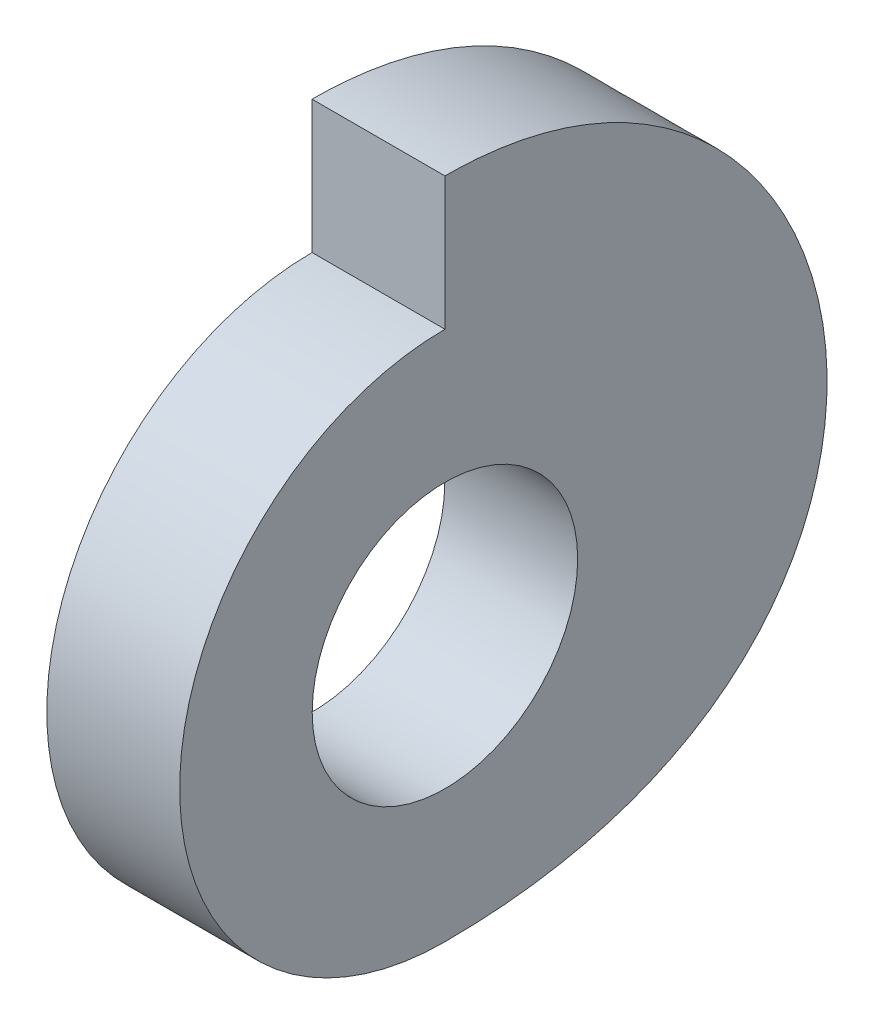
ISO-10303-21;
HEADER;
FILE_DESCRIPTION(('STEP AP214'),'2;1');
FILE_NAME('part.step','',(''),(''),'','','');
FILE_SCHEMA(('AUTOMOTIVE_DESIGN { 1 0 10303 214 1 1 1 1 }'));
ENDSEC;
DATA;
#1=APPLICATION_CONTEXT('core data for automotive mechanical design processes');
#2=APPLICATION_PROTOCOL_DEFINITION('international standard','automotive_design',2000,#1);
#3=PRODUCT_CONTEXT('',#1,'mechanical');
#4=PRODUCT('Part','Part','',(#3));
#5=PRODUCT_RELATED_PRODUCT_CATEGORY('part','',(#4));
#6=PRODUCT_DEFINITION_FORMATION('','',#4);
#7=PRODUCT_DEFINITION_CONTEXT('part definition',#1,'design');
#8=PRODUCT_DEFINITION('design','',#6,#7);
#9=PRODUCT_DEFINITION_SHAPE('','',#8);
#10=(LENGTH_UNIT() NAMED_UNIT(*) SI_UNIT(.MILLI.,.METRE.));
#11=(NAMED_UNIT(*) PLANE_ANGLE_UNIT() SI_UNIT($,.RADIAN.));
#12=(NAMED_UNIT(*) SI_UNIT($,.STERADIAN.) SOLID_ANGLE_UNIT());
#13=UNCERTAINTY_MEASURE_WITH_UNIT(LENGTH_MEASURE(1.E-05),#10,'distance_accuracy_value','');
#14=(GEOMETRIC_REPRESENTATION_CONTEXT(3) GLOBAL_UNCERTAINTY_ASSIGNED_CONTEXT((#13)) GLOBAL_UNIT_ASSIGNED_CONTEXT((#10,
#11,#12)) REPRESENTATION_CONTEXT('',''));
#15=CARTESIAN_POINT('',(0.,0.,0.));
#16=DIRECTION('',(0.,0.,1.));
#17=DIRECTION('',(1.,0.,0.));
#18=AXIS2_PLACEMENT_3D('',#15,#16,#17);
#19=CARTESIAN_POINT('',(12.7,-25.355286684094,0.));
#20=CARTESIAN_POINT('',(12.7,-25.355286684094,-55.8200935883719));
#21=CARTESIAN_POINT('',(12.7,38.0490006456,-41.0288398117355));
#22=CARTESIAN_POINT('',(12.7,38.0490006455999,0.));
#23=B_SPLINE_CURVE_WITH_KNOTS('',3,(#19,#20,#21,#22),.UNSPECIFIED.,.F.,.F.,(4,4),(0.,1.),.UNSPECIFIED.);
#24=DIRECTION('',(-1.,0.,0.));
#25=VECTOR('',#24,1.);
#26=SURFACE_OF_LINEAR_EXTRUSION('',#23,#25);
#27=CARTESIAN_POINT('',(0.,-25.355286684094,0.));
#28=CARTESIAN_POINT('',(0.,-25.355286684094,-55.8200935883719));
#29=CARTESIAN_POINT('',(0.,38.0490006456,-41.0288398117355));
#30=CARTESIAN_POINT('',(0.,38.0490006455999,0.));
#31=B_SPLINE_CURVE_WITH_KNOTS('',3,(#27,#28,#29,#30),.UNSPECIFIED.,.F.,.F.,(4,4),(0.,1.),.UNSPECIFIED.);
#32=CARTESIAN_POINT('',(0.,-25.355286684094,0.));
#33=VERTEX_POINT('',#32);
#34=CARTESIAN_POINT('',(0.,38.0490006455999,0.));
#35=VERTEX_POINT('',#34);
#36=EDGE_CURVE('E80',#33,#35,#31,.T.);
#37=ORIENTED_EDGE('',*,*,#36,.T.);
#38=DIRECTION('',(-1.,0.,0.));
#39=VECTOR('',#38,1.);
#40=CARTESIAN_POINT('',(12.7,38.0490006455999,0.));
#41=LINE('',#40,#39);
#42=CARTESIAN_POINT('',(12.7,38.0490006455999,0.));
#43=VERTEX_POINT('',#42);
#44=EDGE_CURVE('E11',#43,#35,#41,.T.);
#45=ORIENTED_EDGE('',*,*,#44,.F.);
#46=CARTESIAN_POINT('',(12.7,-25.355286684094,0.));
#47=VERTEX_POINT('',#46);
#48=EDGE_CURVE('E74',#47,#43,#23,.T.);
#49=ORIENTED_EDGE('',*,*,#48,.F.);
#50=DIRECTION('',(-1.,0.,0.));
#51=VECTOR('',#50,1.);
#52=CARTESIAN_POINT('',(12.7,-25.355286684094,0.));
#53=LINE('',#52,#51);
#54=EDGE_CURVE('E81',#47,#33,#53,.T.);
#55=ORIENTED_EDGE('',*,*,#54,.T.);
#56=EDGE_LOOP('',(#37,#45,#49,#55));
#57=FACE_BOUND('',#56,.T.);
#58=ADVANCED_FACE('F33',(#57),#26,.F.);
#59=CARTESIAN_POINT('',(12.7,25.355286684094,0.));
#60=DIRECTION('',(0.,0.,-1.));
#61=DIRECTION('',(-1.,0.,0.));
#62=AXIS2_PLACEMENT_3D('',#59,#60,#61);
#63=PLANE('',#62);
#64=DIRECTION('',(0.,-1.,0.));
#65=VECTOR('',#64,1.);
#66=CARTESIAN_POINT('',(0.,25.355286684094,0.));
#67=LINE('',#66,#65);
#68=CARTESIAN_POINT('',(0.,25.355286684094,0.));
#69=VERTEX_POINT('',#68);
#70=EDGE_CURVE('E62',#35,#69,#67,.T.);
#71=ORIENTED_EDGE('',*,*,#70,.T.);
#72=DIRECTION('',(-1.,0.,0.));
#73=VECTOR('',#72,1.);
#74=CARTESIAN_POINT('',(12.7,25.355286684094,0.));
#75=LINE('',#74,#73);
#76=CARTESIAN_POINT('',(12.7,25.355286684094,0.));
#77=VERTEX_POINT('',#76);
#78=EDGE_CURVE('E42',#77,#69,#75,.T.);
#79=ORIENTED_EDGE('',*,*,#78,.F.);
#80=DIRECTION('',(0.,-1.,0.));
#81=VECTOR('',#80,1.);
#82=CARTESIAN_POINT('',(12.7,25.355286684094,0.));
#83=LINE('',#82,#81);
#84=EDGE_CURVE('E70',#43,#77,#83,.T.);
#85=ORIENTED_EDGE('',*,*,#84,.F.);
#86=ORIENTED_EDGE('',*,*,#44,.T.);
#87=EDGE_LOOP('',(#71,#79,#85,#86));
#88=FACE_BOUND('',#87,.T.);
#89=ADVANCED_FACE('F71',(#88),#63,.F.);
#90=CARTESIAN_POINT('',(12.7,0.,0.));
#91=DIRECTION('',(-1.,0.,0.));
#92=DIRECTION('',(0.,0.,1.));
#93=AXIS2_PLACEMENT_3D('',#90,#91,#92);
#94=CYLINDRICAL_SURFACE('',#93,25.355286684094);
#95=CARTESIAN_POINT('',(0.,0.,0.));
#96=DIRECTION('',(1.,0.,0.));
#97=DIRECTION('',(0.,0.,-1.));
#98=AXIS2_PLACEMENT_3D('',#95,#96,#97);
#99=CIRCLE('',#98,25.355286684094);
#100=EDGE_CURVE('E67',#69,#33,#99,.T.);
#101=ORIENTED_EDGE('',*,*,#100,.T.);
#102=ORIENTED_EDGE('',*,*,#54,.F.);
#103=CARTESIAN_POINT('',(12.7,0.,0.));
#104=DIRECTION('',(1.,0.,0.));
#105=DIRECTION('',(0.,0.,-1.));
#106=AXIS2_PLACEMENT_3D('',#103,#104,#105);
#107=CIRCLE('',#106,25.355286684094);
#108=EDGE_CURVE('E50',#77,#47,#107,.T.);
#109=ORIENTED_EDGE('',*,*,#108,.F.);
#110=ORIENTED_EDGE('',*,*,#78,.T.);
#111=EDGE_LOOP('',(#101,#102,#109,#110));
#112=FACE_BOUND('',#111,.T.);
#113=ADVANCED_FACE('F97',(#112),#94,.T.);
#114=CARTESIAN_POINT('',(12.7,6.34685698075296,-36.3183500250403));
#115=DIRECTION('',(-1.,0.,0.));
#116=DIRECTION('',(0.,0.,1.));
#117=AXIS2_PLACEMENT_3D('',#114,#115,#116);
#118=PLANE('',#117);
#119=CARTESIAN_POINT('',(12.7,0.,0.));
#120=DIRECTION('',(1.,0.,0.));
#121=DIRECTION('',(0.,0.,-1.));
#122=AXIS2_PLACEMENT_3D('',#119,#120,#121);
#123=CIRCLE('',#122,12.6885399645466);
#124=CARTESIAN_POINT('',(12.7,0.,-12.6885399645466));
#125=VERTEX_POINT('',#124);
#126=EDGE_CURVE('E87',#125,#125,#123,.T.);
#127=ORIENTED_EDGE('',*,*,#126,.F.);
#128=EDGE_LOOP('',(#127));
#129=FACE_BOUND('',#128,.T.);
#130=ORIENTED_EDGE('',*,*,#48,.T.);
#131=ORIENTED_EDGE('',*,*,#84,.T.);
#132=ORIENTED_EDGE('',*,*,#108,.T.);
#133=EDGE_LOOP('',(#130,#131,#132));
#134=FACE_BOUND('',#133,.T.);
#135=ADVANCED_FACE('F77',(#129,#134),#118,.F.);
#136=CARTESIAN_POINT('',(0.,6.34685698075296,-36.3183500250403));
#137=DIRECTION('',(-1.,0.,0.));
#138=DIRECTION('',(0.,0.,1.));
#139=AXIS2_PLACEMENT_3D('',#136,#137,#138);
#140=PLANE('',#139);
#141=CARTESIAN_POINT('',(0.,0.,0.));
#142=DIRECTION('',(1.,0.,0.));
#143=DIRECTION('',(0.,0.,-1.));
#144=AXIS2_PLACEMENT_3D('',#141,#142,#143);
#145=CIRCLE('',#144,12.6885399645466);
#146=CARTESIAN_POINT('',(0.,0.,-12.6885399645466));
#147=VERTEX_POINT('',#146);
#148=EDGE_CURVE('E83',#147,#147,#145,.T.);
#149=ORIENTED_EDGE('',*,*,#148,.T.);
#150=EDGE_LOOP('',(#149));
#151=FACE_BOUND('',#150,.T.);
#152=ORIENTED_EDGE('',*,*,#36,.F.);
#153=ORIENTED_EDGE('',*,*,#100,.F.);
#154=ORIENTED_EDGE('',*,*,#70,.F.);
#155=EDGE_LOOP('',(#152,#153,#154));
#156=FACE_BOUND('',#155,.T.);
#157=ADVANCED_FACE('F98',(#151,#156),#140,.T.);
#158=CARTESIAN_POINT('',(0.,0.,0.));
#159=DIRECTION('',(1.,0.,0.));
#160=DIRECTION('',(0.,0.,-1.));
#161=AXIS2_PLACEMENT_3D('',#158,#159,#160);
#162=CYLINDRICAL_SURFACE('',#161,12.6885399645466);
#163=ORIENTED_EDGE('',*,*,#148,.F.);
#164=EDGE_LOOP('',(#163));
#165=FACE_BOUND('',#164,.T.);
#166=ORIENTED_EDGE('',*,*,#126,.T.);
#167=EDGE_LOOP('',(#166));
#168=FACE_BOUND('',#167,.T.);
#169=ADVANCED_FACE('F100',(#165,#168),#162,.F.);
#170=CLOSED_SHELL('',(#58,#89,#113,#135,#157,#169));
#171=MANIFOLD_SOLID_BREP('B2',#170);
#172=ADVANCED_BREP_SHAPE_REPRESENTATION('',(#18,#171),#14);
#173=SHAPE_DEFINITION_REPRESENTATION(#9,#172);
ENDSEC;
END-ISO-10303-21;
